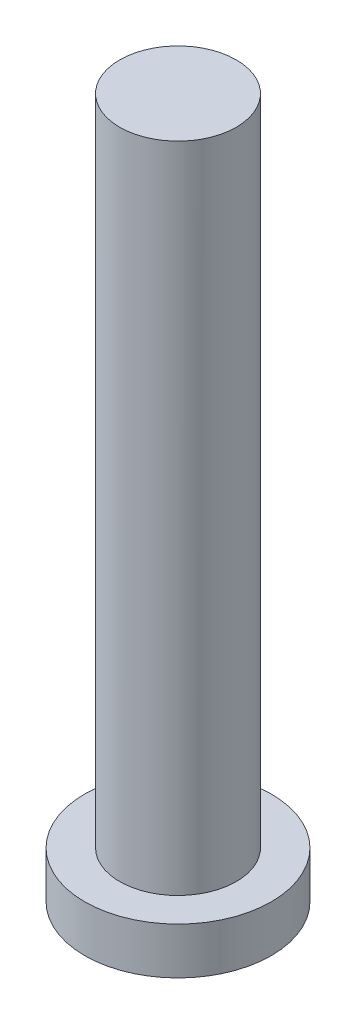
ISO-10303-21;
HEADER;
FILE_DESCRIPTION(('STEP AP214'),'2;1');
FILE_NAME('part.step','',(''),(''),'','','');
FILE_SCHEMA(('AUTOMOTIVE_DESIGN { 1 0 10303 214 1 1 1 1 }'));
ENDSEC;
DATA;
#1=APPLICATION_CONTEXT('core data for automotive mechanical design processes');
#2=APPLICATION_PROTOCOL_DEFINITION('international standard','automotive_design',2000,#1);
#3=PRODUCT_CONTEXT('',#1,'mechanical');
#4=PRODUCT('Part','Part','',(#3));
#5=PRODUCT_RELATED_PRODUCT_CATEGORY('part','',(#4));
#6=PRODUCT_DEFINITION_FORMATION('','',#4);
#7=PRODUCT_DEFINITION_CONTEXT('part definition',#1,'design');
#8=PRODUCT_DEFINITION('design','',#6,#7);
#9=PRODUCT_DEFINITION_SHAPE('','',#8);
#10=(LENGTH_UNIT() NAMED_UNIT(*) SI_UNIT(.MILLI.,.METRE.));
#11=(NAMED_UNIT(*) PLANE_ANGLE_UNIT() SI_UNIT($,.RADIAN.));
#12=(NAMED_UNIT(*) SI_UNIT($,.STERADIAN.) SOLID_ANGLE_UNIT());
#13=UNCERTAINTY_MEASURE_WITH_UNIT(LENGTH_MEASURE(1.E-05),#10,'distance_accuracy_value','');
#14=(GEOMETRIC_REPRESENTATION_CONTEXT(3) GLOBAL_UNCERTAINTY_ASSIGNED_CONTEXT((#13)) GLOBAL_UNIT_ASSIGNED_CONTEXT((#10,
#11,#12)) REPRESENTATION_CONTEXT('',''));
#15=CARTESIAN_POINT('',(0.,0.,0.));
#16=DIRECTION('',(0.,0.,1.));
#17=DIRECTION('',(1.,0.,0.));
#18=AXIS2_PLACEMENT_3D('',#15,#16,#17);
#19=CARTESIAN_POINT('',(0.,14.,0.));
#20=DIRECTION('',(0.,-1.,0.));
#21=DIRECTION('',(0.,0.,-1.));
#22=AXIS2_PLACEMENT_3D('',#19,#20,#21);
#23=CYLINDRICAL_SURFACE('',#22,1.25);
#24=CARTESIAN_POINT('',(0.,14.,0.));
#25=DIRECTION('',(0.,1.,0.));
#26=DIRECTION('',(0.,0.,1.));
#27=AXIS2_PLACEMENT_3D('',#24,#25,#26);
#28=CIRCLE('',#27,1.25);
#29=CARTESIAN_POINT('',(0.,14.,1.25));
#30=VERTEX_POINT('',#29);
#31=EDGE_CURVE('E10',#30,#30,#28,.T.);
#32=ORIENTED_EDGE('',*,*,#31,.F.);
#33=EDGE_LOOP('',(#32));
#34=FACE_BOUND('',#33,.T.);
#35=CARTESIAN_POINT('',(0.,0.,0.));
#36=DIRECTION('',(0.,-1.,0.));
#37=DIRECTION('',(0.,0.,-1.));
#38=AXIS2_PLACEMENT_3D('',#35,#36,#37);
#39=CIRCLE('',#38,1.25);
#40=CARTESIAN_POINT('',(0.,0.,-1.25));
#41=VERTEX_POINT('',#40);
#42=EDGE_CURVE('E37',#41,#41,#39,.T.);
#43=ORIENTED_EDGE('',*,*,#42,.F.);
#44=EDGE_LOOP('',(#43));
#45=FACE_BOUND('',#44,.T.);
#46=ADVANCED_FACE('F31',(#34,#45),#23,.T.);
#47=CARTESIAN_POINT('',(0.,14.,0.));
#48=DIRECTION('',(0.,1.,0.));
#49=DIRECTION('',(0.,0.,1.));
#50=AXIS2_PLACEMENT_3D('',#47,#48,#49);
#51=PLANE('',#50);
#52=ORIENTED_EDGE('',*,*,#31,.T.);
#53=EDGE_LOOP('',(#52));
#54=FACE_BOUND('',#53,.T.);
#55=ADVANCED_FACE('F64',(#54),#51,.T.);
#56=CARTESIAN_POINT('',(0.,-1.,0.));
#57=DIRECTION('',(0.,1.,0.));
#58=DIRECTION('',(0.,0.,1.));
#59=AXIS2_PLACEMENT_3D('',#56,#57,#58);
#60=CYLINDRICAL_SURFACE('',#59,2.);
#61=CARTESIAN_POINT('',(0.,-1.,0.));
#62=DIRECTION('',(0.,-1.,0.));
#63=DIRECTION('',(0.,0.,-1.));
#64=AXIS2_PLACEMENT_3D('',#61,#62,#63);
#65=CIRCLE('',#64,2.);
#66=CARTESIAN_POINT('',(0.,-1.,-2.));
#67=VERTEX_POINT('',#66);
#68=EDGE_CURVE('E41',#67,#67,#65,.T.);
#69=ORIENTED_EDGE('',*,*,#68,.F.);
#70=EDGE_LOOP('',(#69));
#71=FACE_BOUND('',#70,.T.);
#72=CARTESIAN_POINT('',(0.,0.,0.));
#73=DIRECTION('',(0.,-1.,0.));
#74=DIRECTION('',(0.,0.,-1.));
#75=AXIS2_PLACEMENT_3D('',#72,#73,#74);
#76=CIRCLE('',#75,2.);
#77=CARTESIAN_POINT('',(0.,0.,-2.));
#78=VERTEX_POINT('',#77);
#79=EDGE_CURVE('E45',#78,#78,#76,.T.);
#80=ORIENTED_EDGE('',*,*,#79,.T.);
#81=EDGE_LOOP('',(#80));
#82=FACE_BOUND('',#81,.T.);
#83=ADVANCED_FACE('F51',(#71,#82),#60,.T.);
#84=CARTESIAN_POINT('',(0.,-1.,0.));
#85=DIRECTION('',(0.,-1.,0.));
#86=DIRECTION('',(0.,0.,-1.));
#87=AXIS2_PLACEMENT_3D('',#84,#85,#86);
#88=PLANE('',#87);
#89=ORIENTED_EDGE('',*,*,#68,.T.);
#90=EDGE_LOOP('',(#89));
#91=FACE_BOUND('',#90,.T.);
#92=ADVANCED_FACE('F55',(#91),#88,.T.);
#93=CARTESIAN_POINT('',(0.,0.,0.));
#94=DIRECTION('',(0.,-1.,0.));
#95=DIRECTION('',(0.,0.,-1.));
#96=AXIS2_PLACEMENT_3D('',#93,#94,#95);
#97=PLANE('',#96);
#98=ORIENTED_EDGE('',*,*,#42,.T.);
#99=EDGE_LOOP('',(#98));
#100=FACE_BOUND('',#99,.T.);
#101=ORIENTED_EDGE('',*,*,#79,.F.);
#102=EDGE_LOOP('',(#101));
#103=FACE_BOUND('',#102,.T.);
#104=ADVANCED_FACE('F53',(#100,#103),#97,.F.);
#105=CLOSED_SHELL('',(#46,#55,#83,#92,#104));
#106=MANIFOLD_SOLID_BREP('B2',#105);
#107=ADVANCED_BREP_SHAPE_REPRESENTATION('',(#18,#106),#14);
#108=SHAPE_DEFINITION_REPRESENTATION(#9,#107);
ENDSEC;
END-ISO-10303-21;
